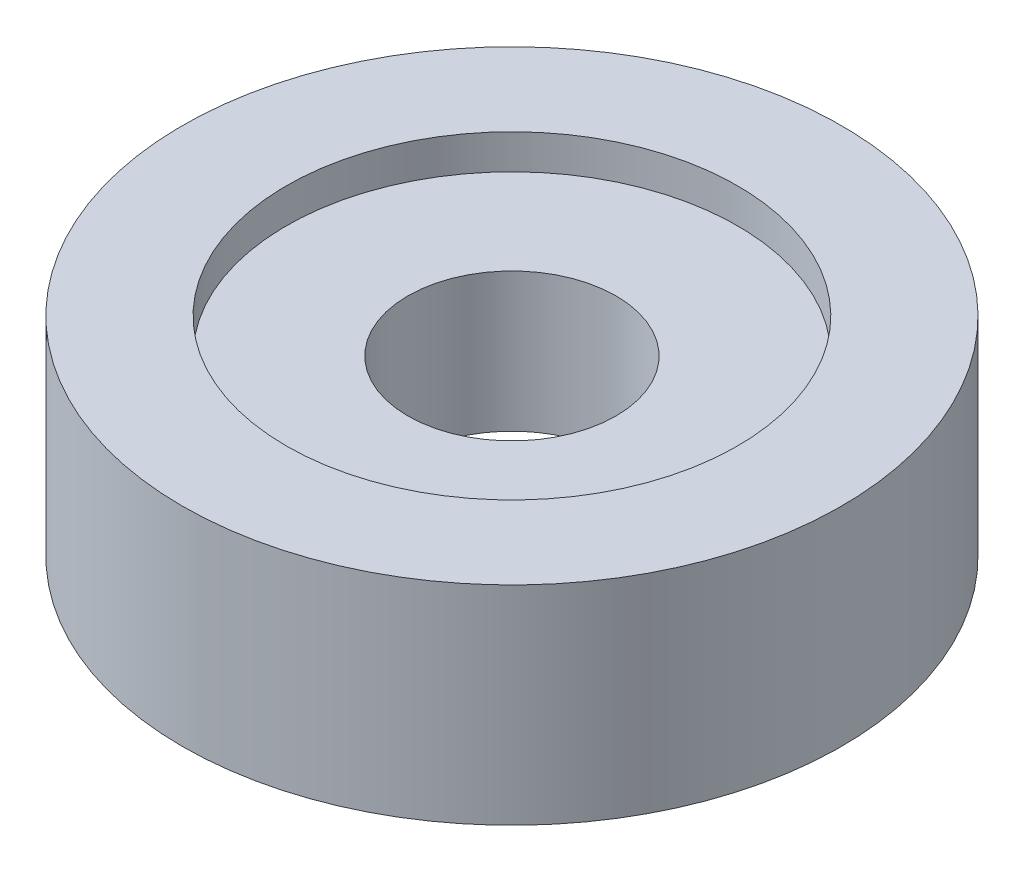
ISO-10303-21;
HEADER;
FILE_DESCRIPTION(('STEP AP214'),'2;1');
FILE_NAME('part.step','',(''),(''),'','','');
FILE_SCHEMA(('AUTOMOTIVE_DESIGN { 1 0 10303 214 1 1 1 1 }'));
ENDSEC;
DATA;
#1=APPLICATION_CONTEXT('core data for automotive mechanical design processes');
#2=APPLICATION_PROTOCOL_DEFINITION('international standard','automotive_design',2000,#1);
#3=PRODUCT_CONTEXT('',#1,'mechanical');
#4=PRODUCT('Part','Part','',(#3));
#5=PRODUCT_RELATED_PRODUCT_CATEGORY('part','',(#4));
#6=PRODUCT_DEFINITION_FORMATION('','',#4);
#7=PRODUCT_DEFINITION_CONTEXT('part definition',#1,'design');
#8=PRODUCT_DEFINITION('design','',#6,#7);
#9=PRODUCT_DEFINITION_SHAPE('','',#8);
#10=(LENGTH_UNIT() NAMED_UNIT(*) SI_UNIT(.MILLI.,.METRE.));
#11=(NAMED_UNIT(*) PLANE_ANGLE_UNIT() SI_UNIT($,.RADIAN.));
#12=(NAMED_UNIT(*) SI_UNIT($,.STERADIAN.) SOLID_ANGLE_UNIT());
#13=UNCERTAINTY_MEASURE_WITH_UNIT(LENGTH_MEASURE(1.E-05),#10,'distance_accuracy_value','');
#14=(GEOMETRIC_REPRESENTATION_CONTEXT(3) GLOBAL_UNCERTAINTY_ASSIGNED_CONTEXT((#13)) GLOBAL_UNIT_ASSIGNED_CONTEXT((#10,
#11,#12)) REPRESENTATION_CONTEXT('',''));
#15=CARTESIAN_POINT('',(0.,0.,0.));
#16=DIRECTION('',(0.,0.,1.));
#17=DIRECTION('',(1.,0.,0.));
#18=AXIS2_PLACEMENT_3D('',#15,#16,#17);
#19=CARTESIAN_POINT('',(0.,0.,0.));
#20=DIRECTION('',(0.,1.,0.));
#21=DIRECTION('',(0.,0.,1.));
#22=AXIS2_PLACEMENT_3D('',#19,#20,#21);
#23=CYLINDRICAL_SURFACE('',#22,3.);
#24=CARTESIAN_POINT('',(0.,5.,0.));
#25=DIRECTION('',(0.,1.,0.));
#26=DIRECTION('',(0.,0.,1.));
#27=AXIS2_PLACEMENT_3D('',#24,#25,#26);
#28=CIRCLE('',#27,3.);
#29=CARTESIAN_POINT('',(0.,5.,3.));
#30=VERTEX_POINT('',#29);
#31=EDGE_CURVE('E70',#30,#30,#28,.T.);
#32=ORIENTED_EDGE('',*,*,#31,.T.);
#33=EDGE_LOOP('',(#32));
#34=FACE_BOUND('',#33,.T.);
#35=CARTESIAN_POINT('',(0.,1.,0.));
#36=DIRECTION('',(0.,-1.,0.));
#37=DIRECTION('',(0.,0.,-1.));
#38=AXIS2_PLACEMENT_3D('',#35,#36,#37);
#39=CIRCLE('',#38,3.);
#40=CARTESIAN_POINT('',(0.,1.,-3.));
#41=VERTEX_POINT('',#40);
#42=EDGE_CURVE('E56',#41,#41,#39,.F.);
#43=ORIENTED_EDGE('',*,*,#42,.F.);
#44=EDGE_LOOP('',(#43));
#45=FACE_BOUND('',#44,.T.);
#46=ADVANCED_FACE('F52',(#34,#45),#23,.F.);
#47=CARTESIAN_POINT('',(0.,0.,0.));
#48=DIRECTION('',(0.,1.,0.));
#49=DIRECTION('',(0.,0.,1.));
#50=AXIS2_PLACEMENT_3D('',#47,#48,#49);
#51=PLANE('',#50);
#52=CARTESIAN_POINT('',(0.,0.,0.));
#53=DIRECTION('',(0.,1.,0.));
#54=DIRECTION('',(0.,0.,1.));
#55=AXIS2_PLACEMENT_3D('',#52,#53,#54);
#56=CIRCLE('',#55,6.5);
#57=CARTESIAN_POINT('',(0.,0.,6.5));
#58=VERTEX_POINT('',#57);
#59=EDGE_CURVE('E75',#58,#58,#56,.T.);
#60=ORIENTED_EDGE('',*,*,#59,.T.);
#61=EDGE_LOOP('',(#60));
#62=FACE_BOUND('',#61,.T.);
#63=CARTESIAN_POINT('',(0.,0.,0.));
#64=DIRECTION('',(0.,1.,0.));
#65=DIRECTION('',(0.,0.,1.));
#66=AXIS2_PLACEMENT_3D('',#63,#64,#65);
#67=CIRCLE('',#66,9.5);
#68=CARTESIAN_POINT('',(0.,0.,9.5));
#69=VERTEX_POINT('',#68);
#70=EDGE_CURVE('E60',#69,#69,#67,.T.);
#71=ORIENTED_EDGE('',*,*,#70,.F.);
#72=EDGE_LOOP('',(#71));
#73=FACE_BOUND('',#72,.T.);
#74=ADVANCED_FACE('F88',(#62,#73),#51,.F.);
#75=CARTESIAN_POINT('',(0.,6.,0.));
#76=DIRECTION('',(0.,-1.,0.));
#77=DIRECTION('',(0.,0.,-1.));
#78=AXIS2_PLACEMENT_3D('',#75,#76,#77);
#79=CYLINDRICAL_SURFACE('',#78,9.5);
#80=CARTESIAN_POINT('',(0.,6.,0.));
#81=DIRECTION('',(0.,1.,0.));
#82=DIRECTION('',(0.,0.,1.));
#83=AXIS2_PLACEMENT_3D('',#80,#81,#82);
#84=CIRCLE('',#83,9.5);
#85=CARTESIAN_POINT('',(0.,6.,9.5));
#86=VERTEX_POINT('',#85);
#87=EDGE_CURVE('E13',#86,#86,#84,.T.);
#88=ORIENTED_EDGE('',*,*,#87,.F.);
#89=EDGE_LOOP('',(#88));
#90=FACE_BOUND('',#89,.T.);
#91=ORIENTED_EDGE('',*,*,#70,.T.);
#92=EDGE_LOOP('',(#91));
#93=FACE_BOUND('',#92,.T.);
#94=ADVANCED_FACE('F54',(#90,#93),#79,.T.);
#95=CARTESIAN_POINT('',(0.,6.,0.));
#96=DIRECTION('',(0.,1.,0.));
#97=DIRECTION('',(0.,0.,1.));
#98=AXIS2_PLACEMENT_3D('',#95,#96,#97);
#99=PLANE('',#98);
#100=CARTESIAN_POINT('',(0.,6.,0.));
#101=DIRECTION('',(0.,1.,0.));
#102=DIRECTION('',(0.,0.,1.));
#103=AXIS2_PLACEMENT_3D('',#100,#101,#102);
#104=CIRCLE('',#103,6.5);
#105=CARTESIAN_POINT('',(0.,6.,6.5));
#106=VERTEX_POINT('',#105);
#107=EDGE_CURVE('E67',#106,#106,#104,.T.);
#108=ORIENTED_EDGE('',*,*,#107,.F.);
#109=EDGE_LOOP('',(#108));
#110=FACE_BOUND('',#109,.T.);
#111=ORIENTED_EDGE('',*,*,#87,.T.);
#112=EDGE_LOOP('',(#111));
#113=FACE_BOUND('',#112,.T.);
#114=ADVANCED_FACE('F95',(#110,#113),#99,.T.);
#115=CARTESIAN_POINT('',(0.,5.,0.));
#116=DIRECTION('',(0.,1.,0.));
#117=DIRECTION('',(0.,0.,1.));
#118=AXIS2_PLACEMENT_3D('',#115,#116,#117);
#119=CYLINDRICAL_SURFACE('',#118,6.5);
#120=CARTESIAN_POINT('',(0.,5.,0.));
#121=DIRECTION('',(0.,1.,0.));
#122=DIRECTION('',(0.,0.,1.));
#123=AXIS2_PLACEMENT_3D('',#120,#121,#122);
#124=CIRCLE('',#123,6.5);
#125=CARTESIAN_POINT('',(0.,5.,6.5));
#126=VERTEX_POINT('',#125);
#127=EDGE_CURVE('E65',#126,#126,#124,.T.);
#128=ORIENTED_EDGE('',*,*,#127,.F.);
#129=EDGE_LOOP('',(#128));
#130=FACE_BOUND('',#129,.T.);
#131=ORIENTED_EDGE('',*,*,#107,.T.);
#132=EDGE_LOOP('',(#131));
#133=FACE_BOUND('',#132,.T.);
#134=ADVANCED_FACE('F103',(#130,#133),#119,.F.);
#135=CARTESIAN_POINT('',(0.,5.,0.));
#136=DIRECTION('',(0.,1.,0.));
#137=DIRECTION('',(0.,0.,1.));
#138=AXIS2_PLACEMENT_3D('',#135,#136,#137);
#139=PLANE('',#138);
#140=ORIENTED_EDGE('',*,*,#31,.F.);
#141=EDGE_LOOP('',(#140));
#142=FACE_BOUND('',#141,.T.);
#143=ORIENTED_EDGE('',*,*,#127,.T.);
#144=EDGE_LOOP('',(#143));
#145=FACE_BOUND('',#144,.T.);
#146=ADVANCED_FACE('F112',(#142,#145),#139,.T.);
#147=CARTESIAN_POINT('',(0.,1.,0.));
#148=DIRECTION('',(0.,-1.,0.));
#149=DIRECTION('',(0.,0.,1.));
#150=AXIS2_PLACEMENT_3D('',#147,#148,#149);
#151=PLANE('',#150);
#152=CARTESIAN_POINT('',(0.,1.,0.));
#153=DIRECTION('',(0.,1.,0.));
#154=DIRECTION('',(0.,0.,1.));
#155=AXIS2_PLACEMENT_3D('',#152,#153,#154);
#156=CIRCLE('',#155,6.5);
#157=CARTESIAN_POINT('',(0.,1.,6.5));
#158=VERTEX_POINT('',#157);
#159=EDGE_CURVE('E78',#158,#158,#156,.T.);
#160=ORIENTED_EDGE('',*,*,#159,.F.);
#161=EDGE_LOOP('',(#160));
#162=FACE_BOUND('',#161,.T.);
#163=ORIENTED_EDGE('',*,*,#42,.T.);
#164=EDGE_LOOP('',(#163));
#165=FACE_BOUND('',#164,.T.);
#166=ADVANCED_FACE('F85',(#162,#165),#151,.T.);
#167=CARTESIAN_POINT('',(0.,1.,0.));
#168=DIRECTION('',(0.,-1.,0.));
#169=DIRECTION('',(0.,0.,-1.));
#170=AXIS2_PLACEMENT_3D('',#167,#168,#169);
#171=CYLINDRICAL_SURFACE('',#170,6.5);
#172=ORIENTED_EDGE('',*,*,#159,.T.);
#173=EDGE_LOOP('',(#172));
#174=FACE_BOUND('',#173,.T.);
#175=ORIENTED_EDGE('',*,*,#59,.F.);
#176=EDGE_LOOP('',(#175));
#177=FACE_BOUND('',#176,.T.);
#178=ADVANCED_FACE('F121',(#174,#177),#171,.F.);
#179=CLOSED_SHELL('',(#46,#74,#94,#114,#134,#146,#166,#178));
#180=MANIFOLD_SOLID_BREP('B2',#179);
#181=ADVANCED_BREP_SHAPE_REPRESENTATION('',(#18,#180),#14);
#182=SHAPE_DEFINITION_REPRESENTATION(#9,#181);
ENDSEC;
END-ISO-10303-21;
